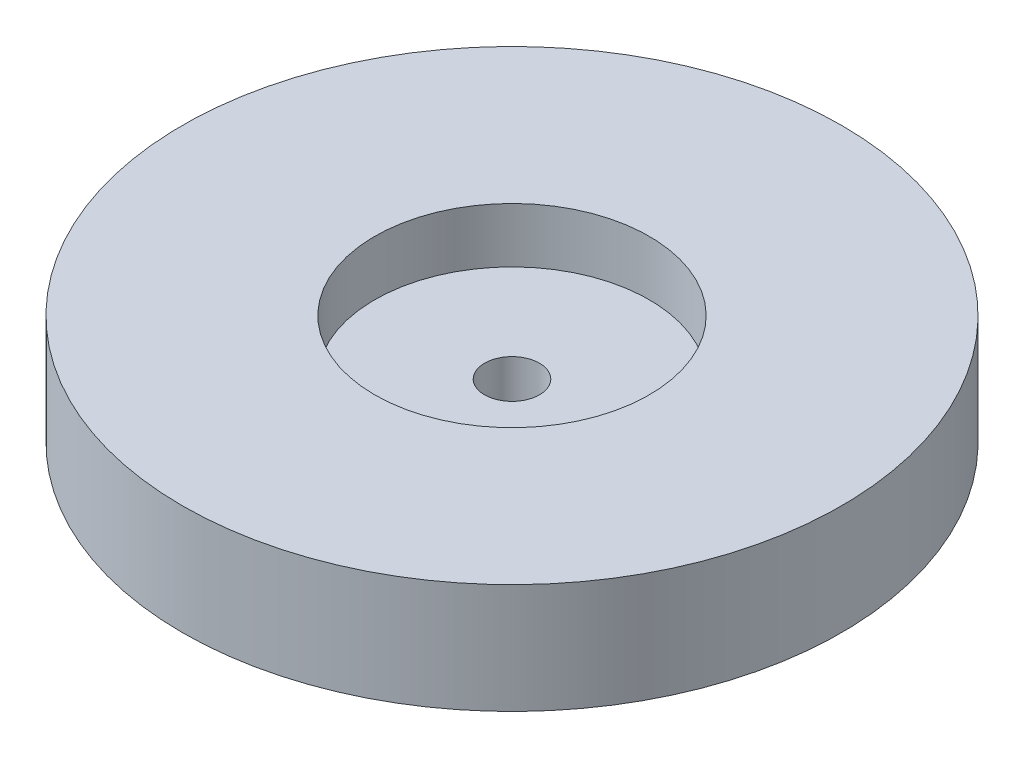
ISO-10303-21;
HEADER;
FILE_DESCRIPTION(('STEP AP214'),'2;1');
FILE_NAME('part.step','',(''),(''),'','','');
FILE_SCHEMA(('AUTOMOTIVE_DESIGN { 1 0 10303 214 1 1 1 1 }'));
ENDSEC;
DATA;
#1=APPLICATION_CONTEXT('core data for automotive mechanical design processes');
#2=APPLICATION_PROTOCOL_DEFINITION('international standard','automotive_design',2000,#1);
#3=PRODUCT_CONTEXT('',#1,'mechanical');
#4=PRODUCT('Part','Part','',(#3));
#5=PRODUCT_RELATED_PRODUCT_CATEGORY('part','',(#4));
#6=PRODUCT_DEFINITION_FORMATION('','',#4);
#7=PRODUCT_DEFINITION_CONTEXT('part definition',#1,'design');
#8=PRODUCT_DEFINITION('design','',#6,#7);
#9=PRODUCT_DEFINITION_SHAPE('','',#8);
#10=(LENGTH_UNIT() NAMED_UNIT(*) SI_UNIT(.MILLI.,.METRE.));
#11=(NAMED_UNIT(*) PLANE_ANGLE_UNIT() SI_UNIT($,.RADIAN.));
#12=(NAMED_UNIT(*) SI_UNIT($,.STERADIAN.) SOLID_ANGLE_UNIT());
#13=UNCERTAINTY_MEASURE_WITH_UNIT(LENGTH_MEASURE(1.E-05),#10,'distance_accuracy_value','');
#14=(GEOMETRIC_REPRESENTATION_CONTEXT(3) GLOBAL_UNCERTAINTY_ASSIGNED_CONTEXT((#13)) GLOBAL_UNIT_ASSIGNED_CONTEXT((#10,
#11,#12)) REPRESENTATION_CONTEXT('',''));
#15=CARTESIAN_POINT('',(0.,0.,0.));
#16=DIRECTION('',(0.,0.,1.));
#17=DIRECTION('',(1.,0.,0.));
#18=AXIS2_PLACEMENT_3D('',#15,#16,#17);
#19=CARTESIAN_POINT('',(0.,10.,0.));
#20=DIRECTION('',(0.,-1.,0.));
#21=DIRECTION('',(0.,0.,-1.));
#22=AXIS2_PLACEMENT_3D('',#19,#20,#21);
#23=CYLINDRICAL_SURFACE('',#22,12.5);
#24=CARTESIAN_POINT('',(0.,5.,0.));
#25=DIRECTION('',(0.,1.,0.));
#26=DIRECTION('',(0.,0.,1.));
#27=AXIS2_PLACEMENT_3D('',#24,#25,#26);
#28=CIRCLE('',#27,12.5);
#29=CARTESIAN_POINT('',(0.,5.,12.5));
#30=VERTEX_POINT('',#29);
#31=EDGE_CURVE('E10',#30,#30,#28,.T.);
#32=ORIENTED_EDGE('',*,*,#31,.F.);
#33=EDGE_LOOP('',(#32));
#34=FACE_BOUND('',#33,.T.);
#35=CARTESIAN_POINT('',(0.,10.,0.));
#36=DIRECTION('',(0.,1.,0.));
#37=DIRECTION('',(0.,0.,1.));
#38=AXIS2_PLACEMENT_3D('',#35,#36,#37);
#39=CIRCLE('',#38,12.5);
#40=CARTESIAN_POINT('',(0.,10.,12.5));
#41=VERTEX_POINT('',#40);
#42=EDGE_CURVE('E45',#41,#41,#39,.T.);
#43=ORIENTED_EDGE('',*,*,#42,.T.);
#44=EDGE_LOOP('',(#43));
#45=FACE_BOUND('',#44,.T.);
#46=ADVANCED_FACE('F35',(#34,#45),#23,.F.);
#47=CARTESIAN_POINT('',(0.,10.,0.));
#48=DIRECTION('',(0.,-1.,0.));
#49=DIRECTION('',(0.,0.,-1.));
#50=AXIS2_PLACEMENT_3D('',#47,#48,#49);
#51=CYLINDRICAL_SURFACE('',#50,30.);
#52=CARTESIAN_POINT('',(0.,10.,0.));
#53=DIRECTION('',(0.,1.,0.));
#54=DIRECTION('',(0.,0.,1.));
#55=AXIS2_PLACEMENT_3D('',#52,#53,#54);
#56=CIRCLE('',#55,30.);
#57=CARTESIAN_POINT('',(0.,10.,30.));
#58=VERTEX_POINT('',#57);
#59=EDGE_CURVE('E41',#58,#58,#56,.T.);
#60=ORIENTED_EDGE('',*,*,#59,.F.);
#61=EDGE_LOOP('',(#60));
#62=FACE_BOUND('',#61,.T.);
#63=CARTESIAN_POINT('',(0.,0.,0.));
#64=DIRECTION('',(0.,1.,0.));
#65=DIRECTION('',(0.,0.,1.));
#66=AXIS2_PLACEMENT_3D('',#63,#64,#65);
#67=CIRCLE('',#66,30.);
#68=CARTESIAN_POINT('',(0.,0.,30.));
#69=VERTEX_POINT('',#68);
#70=EDGE_CURVE('E50',#69,#69,#67,.T.);
#71=ORIENTED_EDGE('',*,*,#70,.T.);
#72=EDGE_LOOP('',(#71));
#73=FACE_BOUND('',#72,.T.);
#74=ADVANCED_FACE('F82',(#62,#73),#51,.T.);
#75=CARTESIAN_POINT('',(0.,10.,0.));
#76=DIRECTION('',(0.,1.,0.));
#77=DIRECTION('',(0.,0.,1.));
#78=AXIS2_PLACEMENT_3D('',#75,#76,#77);
#79=PLANE('',#78);
#80=ORIENTED_EDGE('',*,*,#42,.F.);
#81=EDGE_LOOP('',(#80));
#82=FACE_BOUND('',#81,.T.);
#83=ORIENTED_EDGE('',*,*,#59,.T.);
#84=EDGE_LOOP('',(#83));
#85=FACE_BOUND('',#84,.T.);
#86=ADVANCED_FACE('F77',(#82,#85),#79,.T.);
#87=CARTESIAN_POINT('',(0.,0.,0.));
#88=DIRECTION('',(0.,1.,0.));
#89=DIRECTION('',(0.,0.,1.));
#90=AXIS2_PLACEMENT_3D('',#87,#88,#89);
#91=PLANE('',#90);
#92=ORIENTED_EDGE('',*,*,#70,.F.);
#93=EDGE_LOOP('',(#92));
#94=FACE_BOUND('',#93,.T.);
#95=CARTESIAN_POINT('',(0.,0.,0.));
#96=DIRECTION('',(0.,1.,0.));
#97=DIRECTION('',(0.,0.,1.));
#98=AXIS2_PLACEMENT_3D('',#95,#96,#97);
#99=CIRCLE('',#98,2.5);
#100=CARTESIAN_POINT('',(0.,0.,2.5));
#101=VERTEX_POINT('',#100);
#102=EDGE_CURVE('E58',#101,#101,#99,.T.);
#103=ORIENTED_EDGE('',*,*,#102,.T.);
#104=EDGE_LOOP('',(#103));
#105=FACE_BOUND('',#104,.T.);
#106=ADVANCED_FACE('F65',(#94,#105),#91,.F.);
#107=CARTESIAN_POINT('',(0.,5.,0.));
#108=DIRECTION('',(0.,-1.,0.));
#109=DIRECTION('',(0.,0.,-1.));
#110=AXIS2_PLACEMENT_3D('',#107,#108,#109);
#111=CYLINDRICAL_SURFACE('',#110,2.5);
#112=CARTESIAN_POINT('',(0.,5.,0.));
#113=DIRECTION('',(0.,1.,0.));
#114=DIRECTION('',(0.,0.,1.));
#115=AXIS2_PLACEMENT_3D('',#112,#113,#114);
#116=CIRCLE('',#115,2.5);
#117=CARTESIAN_POINT('',(0.,5.,2.5));
#118=VERTEX_POINT('',#117);
#119=EDGE_CURVE('E54',#118,#118,#116,.T.);
#120=ORIENTED_EDGE('',*,*,#119,.T.);
#121=EDGE_LOOP('',(#120));
#122=FACE_BOUND('',#121,.T.);
#123=ORIENTED_EDGE('',*,*,#102,.F.);
#124=EDGE_LOOP('',(#123));
#125=FACE_BOUND('',#124,.T.);
#126=ADVANCED_FACE('F67',(#122,#125),#111,.F.);
#127=CARTESIAN_POINT('',(0.,5.,0.));
#128=DIRECTION('',(0.,1.,0.));
#129=DIRECTION('',(0.,0.,1.));
#130=AXIS2_PLACEMENT_3D('',#127,#128,#129);
#131=PLANE('',#130);
#132=ORIENTED_EDGE('',*,*,#119,.F.);
#133=EDGE_LOOP('',(#132));
#134=FACE_BOUND('',#133,.T.);
#135=ORIENTED_EDGE('',*,*,#31,.T.);
#136=EDGE_LOOP('',(#135));
#137=FACE_BOUND('',#136,.T.);
#138=ADVANCED_FACE('F69',(#134,#137),#131,.T.);
#139=CLOSED_SHELL('',(#46,#74,#86,#106,#126,#138));
#140=MANIFOLD_SOLID_BREP('B2',#139);
#141=ADVANCED_BREP_SHAPE_REPRESENTATION('',(#18,#140),#14);
#142=SHAPE_DEFINITION_REPRESENTATION(#9,#141);
ENDSEC;
END-ISO-10303-21;
